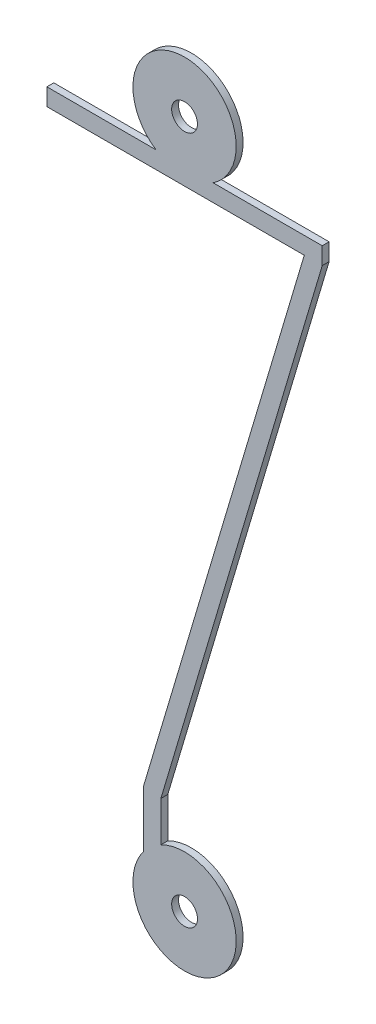
ISO-10303-21;
HEADER;
FILE_DESCRIPTION(('STEP AP214'),'2;1');
FILE_NAME('part.step','',(''),(''),'','','');
FILE_SCHEMA(('AUTOMOTIVE_DESIGN { 1 0 10303 214 1 1 1 1 }'));
ENDSEC;
DATA;
#1=APPLICATION_CONTEXT('core data for automotive mechanical design processes');
#2=APPLICATION_PROTOCOL_DEFINITION('international standard','automotive_design',2000,#1);
#3=PRODUCT_CONTEXT('',#1,'mechanical');
#4=PRODUCT('Part','Part','',(#3));
#5=PRODUCT_RELATED_PRODUCT_CATEGORY('part','',(#4));
#6=PRODUCT_DEFINITION_FORMATION('','',#4);
#7=PRODUCT_DEFINITION_CONTEXT('part definition',#1,'design');
#8=PRODUCT_DEFINITION('design','',#6,#7);
#9=PRODUCT_DEFINITION_SHAPE('','',#8);
#10=(LENGTH_UNIT() NAMED_UNIT(*) SI_UNIT(.MILLI.,.METRE.));
#11=(NAMED_UNIT(*) PLANE_ANGLE_UNIT() SI_UNIT($,.RADIAN.));
#12=(NAMED_UNIT(*) SI_UNIT($,.STERADIAN.) SOLID_ANGLE_UNIT());
#13=UNCERTAINTY_MEASURE_WITH_UNIT(LENGTH_MEASURE(1.E-05),#10,'distance_accuracy_value','');
#14=(GEOMETRIC_REPRESENTATION_CONTEXT(3) GLOBAL_UNCERTAINTY_ASSIGNED_CONTEXT((#13)) GLOBAL_UNIT_ASSIGNED_CONTEXT((#10,
#11,#12)) REPRESENTATION_CONTEXT('',''));
#15=CARTESIAN_POINT('',(0.,0.,0.));
#16=DIRECTION('',(0.,0.,1.));
#17=DIRECTION('',(1.,0.,0.));
#18=AXIS2_PLACEMENT_3D('',#15,#16,#17);
#19=CARTESIAN_POINT('',(0.,10.,0.1));
#20=DIRECTION('',(0.,0.,1.));
#21=DIRECTION('',(1.,0.,0.));
#22=AXIS2_PLACEMENT_3D('',#19,#20,#21);
#23=PLANE('',#22);
#24=CARTESIAN_POINT('',(0.,10.,0.1));
#25=DIRECTION('',(0.,0.,1.));
#26=DIRECTION('',(1.,0.,0.));
#27=AXIS2_PLACEMENT_3D('',#24,#25,#26);
#28=CIRCLE('',#27,0.375);
#29=CARTESIAN_POINT('',(0.375,10.,0.1));
#30=VERTEX_POINT('',#29);
#31=EDGE_CURVE('E155',#30,#30,#28,.T.);
#32=ORIENTED_EDGE('',*,*,#31,.F.);
#33=EDGE_LOOP('',(#32));
#34=FACE_BOUND('',#33,.T.);
#35=CARTESIAN_POINT('',(0.,10.,0.1));
#36=DIRECTION('',(0.,0.,1.));
#37=DIRECTION('',(1.,0.,0.));
#38=AXIS2_PLACEMENT_3D('',#35,#36,#37);
#39=CIRCLE('',#38,1.5);
#40=CARTESIAN_POINT('',(0.829156197588853,8.75,0.1));
#41=VERTEX_POINT('',#40);
#42=CARTESIAN_POINT('',(-0.829156197588853,8.75,0.1));
#43=VERTEX_POINT('',#42);
#44=EDGE_CURVE('E172',#41,#43,#39,.T.);
#45=ORIENTED_EDGE('',*,*,#44,.T.);
#46=DIRECTION('',(-1.,0.,0.));
#47=VECTOR('',#46,1.);
#48=CARTESIAN_POINT('',(-4.,8.75,0.1));
#49=LINE('',#48,#47);
#50=CARTESIAN_POINT('',(-4.,8.75,0.1));
#51=VERTEX_POINT('',#50);
#52=EDGE_CURVE('E105',#43,#51,#49,.T.);
#53=ORIENTED_EDGE('',*,*,#52,.T.);
#54=DIRECTION('',(0.,-1.,0.));
#55=VECTOR('',#54,1.);
#56=CARTESIAN_POINT('',(-4.,8.75,0.1));
#57=LINE('',#56,#55);
#58=CARTESIAN_POINT('',(-4.,8.25,0.1));
#59=VERTEX_POINT('',#58);
#60=EDGE_CURVE('E196',#51,#59,#57,.T.);
#61=ORIENTED_EDGE('',*,*,#60,.T.);
#62=DIRECTION('',(1.,0.,0.));
#63=VECTOR('',#62,1.);
#64=CARTESIAN_POINT('',(-4.,8.25,0.1));
#65=LINE('',#64,#63);
#66=CARTESIAN_POINT('',(3.47832550917606,8.25,0.1));
#67=VERTEX_POINT('',#66);
#68=EDGE_CURVE('E215',#59,#67,#65,.T.);
#69=ORIENTED_EDGE('',*,*,#68,.T.);
#70=DIRECTION('',(-0.285253594774189,-0.958452078441276,0.));
#71=VECTOR('',#70,1.);
#72=CARTESIAN_POINT('',(3.47832550917606,8.25,0.1));
#73=LINE('',#72,#71);
#74=CARTESIAN_POINT('',(-1.18749999999999,-7.42717371083153,0.1));
#75=VERTEX_POINT('',#74);
#76=EDGE_CURVE('E212',#67,#75,#73,.T.);
#77=ORIENTED_EDGE('',*,*,#76,.T.);
#78=DIRECTION('',(0.,-1.,0.));
#79=VECTOR('',#78,1.);
#80=CARTESIAN_POINT('',(-1.18749999999999,-9.08357010633655,0.1));
#81=LINE('',#80,#79);
#82=CARTESIAN_POINT('',(-1.18749999999999,-9.08357010633655,0.1));
#83=VERTEX_POINT('',#82);
#84=EDGE_CURVE('E214',#75,#83,#81,.T.);
#85=ORIENTED_EDGE('',*,*,#84,.T.);
#86=CARTESIAN_POINT('',(0.,-10.,0.1));
#87=DIRECTION('',(0.,0.,1.));
#88=DIRECTION('',(1.,0.,0.));
#89=AXIS2_PLACEMENT_3D('',#86,#87,#88);
#90=CIRCLE('',#89,1.5);
#91=CARTESIAN_POINT('',(-0.687499999999994,-8.66682943701865,0.1));
#92=VERTEX_POINT('',#91);
#93=EDGE_CURVE('E217',#83,#92,#90,.T.);
#94=ORIENTED_EDGE('',*,*,#93,.T.);
#95=DIRECTION('',(0.,1.,0.));
#96=VECTOR('',#95,1.);
#97=CARTESIAN_POINT('',(-0.687499999999994,-8.66682943701865,0.1));
#98=LINE('',#97,#96);
#99=CARTESIAN_POINT('',(-0.687499999999994,-7.5,0.1));
#100=VERTEX_POINT('',#99);
#101=EDGE_CURVE('E133',#92,#100,#98,.T.);
#102=ORIENTED_EDGE('',*,*,#101,.T.);
#103=DIRECTION('',(0.285253594774189,0.958452078441276,0.));
#104=VECTOR('',#103,1.);
#105=CARTESIAN_POINT('',(4.,8.25,0.1));
#106=LINE('',#105,#104);
#107=CARTESIAN_POINT('',(4.,8.25,0.1));
#108=VERTEX_POINT('',#107);
#109=EDGE_CURVE('E127',#100,#108,#106,.T.);
#110=ORIENTED_EDGE('',*,*,#109,.T.);
#111=DIRECTION('',(0.,1.,0.));
#112=VECTOR('',#111,1.);
#113=CARTESIAN_POINT('',(4.,8.75,0.1));
#114=LINE('',#113,#112);
#115=CARTESIAN_POINT('',(4.,8.75,0.1));
#116=VERTEX_POINT('',#115);
#117=EDGE_CURVE('E131',#108,#116,#114,.T.);
#118=ORIENTED_EDGE('',*,*,#117,.T.);
#119=DIRECTION('',(-1.,0.,0.));
#120=VECTOR('',#119,1.);
#121=CARTESIAN_POINT('',(0.829156197588853,8.75,0.1));
#122=LINE('',#121,#120);
#123=EDGE_CURVE('E53',#116,#41,#122,.T.);
#124=ORIENTED_EDGE('',*,*,#123,.T.);
#125=EDGE_LOOP('',(#45,#53,#61,#69,#77,#85,#94,#102,#110,#118,#124));
#126=FACE_BOUND('',#125,.T.);
#127=CARTESIAN_POINT('',(0.,-10.,0.1));
#128=DIRECTION('',(0.,0.,1.));
#129=DIRECTION('',(1.,0.,0.));
#130=AXIS2_PLACEMENT_3D('',#127,#128,#129);
#131=CIRCLE('',#130,0.375);
#132=CARTESIAN_POINT('',(0.375000000000006,-10.,0.1));
#133=VERTEX_POINT('',#132);
#134=EDGE_CURVE('E262',#133,#133,#131,.T.);
#135=ORIENTED_EDGE('',*,*,#134,.F.);
#136=EDGE_LOOP('',(#135));
#137=FACE_BOUND('',#136,.T.);
#138=ADVANCED_FACE('F36',(#34,#126,#137),#23,.T.);
#139=CARTESIAN_POINT('',(0.,10.,-0.1));
#140=DIRECTION('',(0.,0.,1.));
#141=DIRECTION('',(1.,0.,0.));
#142=AXIS2_PLACEMENT_3D('',#139,#140,#141);
#143=PLANE('',#142);
#144=CARTESIAN_POINT('',(0.,10.,-0.1));
#145=DIRECTION('',(0.,0.,1.));
#146=DIRECTION('',(1.,0.,0.));
#147=AXIS2_PLACEMENT_3D('',#144,#145,#146);
#148=CIRCLE('',#147,1.5);
#149=CARTESIAN_POINT('',(0.829156197588853,8.75,-0.1));
#150=VERTEX_POINT('',#149);
#151=CARTESIAN_POINT('',(-0.829156197588853,8.75,-0.1));
#152=VERTEX_POINT('',#151);
#153=EDGE_CURVE('E151',#150,#152,#148,.T.);
#154=ORIENTED_EDGE('',*,*,#153,.F.);
#155=DIRECTION('',(-1.,0.,0.));
#156=VECTOR('',#155,1.);
#157=CARTESIAN_POINT('',(0.829156197588853,8.75,-0.1));
#158=LINE('',#157,#156);
#159=CARTESIAN_POINT('',(4.,8.75,-0.1));
#160=VERTEX_POINT('',#159);
#161=EDGE_CURVE('E97',#160,#150,#158,.T.);
#162=ORIENTED_EDGE('',*,*,#161,.F.);
#163=DIRECTION('',(0.,1.,0.));
#164=VECTOR('',#163,1.);
#165=CARTESIAN_POINT('',(4.,8.75,-0.1));
#166=LINE('',#165,#164);
#167=CARTESIAN_POINT('',(4.,8.25,-0.1));
#168=VERTEX_POINT('',#167);
#169=EDGE_CURVE('E91',#168,#160,#166,.T.);
#170=ORIENTED_EDGE('',*,*,#169,.F.);
#171=DIRECTION('',(0.285253594774189,0.958452078441276,0.));
#172=VECTOR('',#171,1.);
#173=CARTESIAN_POINT('',(4.,8.25,-0.1));
#174=LINE('',#173,#172);
#175=CARTESIAN_POINT('',(-0.687499999999994,-7.5,-0.1));
#176=VERTEX_POINT('',#175);
#177=EDGE_CURVE('E141',#176,#168,#174,.T.);
#178=ORIENTED_EDGE('',*,*,#177,.F.);
#179=DIRECTION('',(0.,1.,0.));
#180=VECTOR('',#179,1.);
#181=CARTESIAN_POINT('',(-0.687499999999994,-8.66682943701865,-0.1));
#182=LINE('',#181,#180);
#183=CARTESIAN_POINT('',(-0.687499999999994,-8.66682943701865,-0.1));
#184=VERTEX_POINT('',#183);
#185=EDGE_CURVE('E167',#184,#176,#182,.T.);
#186=ORIENTED_EDGE('',*,*,#185,.F.);
#187=CARTESIAN_POINT('',(0.,-10.,-0.1));
#188=DIRECTION('',(0.,0.,1.));
#189=DIRECTION('',(1.,0.,0.));
#190=AXIS2_PLACEMENT_3D('',#187,#188,#189);
#191=CIRCLE('',#190,1.5);
#192=CARTESIAN_POINT('',(-1.18749999999999,-9.08357010633655,-0.1));
#193=VERTEX_POINT('',#192);
#194=EDGE_CURVE('E165',#193,#184,#191,.T.);
#195=ORIENTED_EDGE('',*,*,#194,.F.);
#196=DIRECTION('',(0.,-1.,0.));
#197=VECTOR('',#196,1.);
#198=CARTESIAN_POINT('',(-1.18749999999999,-9.08357010633655,-0.1));
#199=LINE('',#198,#197);
#200=CARTESIAN_POINT('',(-1.18749999999999,-7.42717371083153,-0.1));
#201=VERTEX_POINT('',#200);
#202=EDGE_CURVE('E163',#201,#193,#199,.T.);
#203=ORIENTED_EDGE('',*,*,#202,.F.);
#204=DIRECTION('',(-0.285253594774189,-0.958452078441276,0.));
#205=VECTOR('',#204,1.);
#206=CARTESIAN_POINT('',(3.47832550917606,8.25,-0.1));
#207=LINE('',#206,#205);
#208=CARTESIAN_POINT('',(3.47832550917606,8.25,-0.1));
#209=VERTEX_POINT('',#208);
#210=EDGE_CURVE('E161',#209,#201,#207,.T.);
#211=ORIENTED_EDGE('',*,*,#210,.F.);
#212=DIRECTION('',(1.,0.,0.));
#213=VECTOR('',#212,1.);
#214=CARTESIAN_POINT('',(-4.,8.25,-0.1));
#215=LINE('',#214,#213);
#216=CARTESIAN_POINT('',(-4.,8.25,-0.1));
#217=VERTEX_POINT('',#216);
#218=EDGE_CURVE('E159',#217,#209,#215,.T.);
#219=ORIENTED_EDGE('',*,*,#218,.F.);
#220=DIRECTION('',(0.,-1.,0.));
#221=VECTOR('',#220,1.);
#222=CARTESIAN_POINT('',(-4.,8.75,-0.1));
#223=LINE('',#222,#221);
#224=CARTESIAN_POINT('',(-4.,8.75,-0.1));
#225=VERTEX_POINT('',#224);
#226=EDGE_CURVE('E157',#225,#217,#223,.T.);
#227=ORIENTED_EDGE('',*,*,#226,.F.);
#228=DIRECTION('',(-1.,0.,0.));
#229=VECTOR('',#228,1.);
#230=CARTESIAN_POINT('',(-4.,8.75,-0.1));
#231=LINE('',#230,#229);
#232=EDGE_CURVE('E154',#152,#225,#231,.T.);
#233=ORIENTED_EDGE('',*,*,#232,.F.);
#234=EDGE_LOOP('',(#154,#162,#170,#178,#186,#195,#203,#211,#219,#227,#233));
#235=FACE_BOUND('',#234,.T.);
#236=CARTESIAN_POINT('',(0.,10.,-0.1));
#237=DIRECTION('',(0.,0.,1.));
#238=DIRECTION('',(1.,0.,0.));
#239=AXIS2_PLACEMENT_3D('',#236,#237,#238);
#240=CIRCLE('',#239,0.375);
#241=CARTESIAN_POINT('',(0.375,10.,-0.1));
#242=VERTEX_POINT('',#241);
#243=EDGE_CURVE('E268',#242,#242,#240,.T.);
#244=ORIENTED_EDGE('',*,*,#243,.T.);
#245=EDGE_LOOP('',(#244));
#246=FACE_BOUND('',#245,.T.);
#247=CARTESIAN_POINT('',(0.,-10.,-0.1));
#248=DIRECTION('',(0.,0.,1.));
#249=DIRECTION('',(1.,0.,0.));
#250=AXIS2_PLACEMENT_3D('',#247,#248,#249);
#251=CIRCLE('',#250,0.375);
#252=CARTESIAN_POINT('',(0.375000000000006,-10.,-0.1));
#253=VERTEX_POINT('',#252);
#254=EDGE_CURVE('E265',#253,#253,#251,.T.);
#255=ORIENTED_EDGE('',*,*,#254,.T.);
#256=EDGE_LOOP('',(#255));
#257=FACE_BOUND('',#256,.T.);
#258=ADVANCED_FACE('F200',(#235,#246,#257),#143,.F.);
#259=CARTESIAN_POINT('',(0.,10.,0.1));
#260=DIRECTION('',(0.,0.,-1.));
#261=DIRECTION('',(-1.,0.,0.));
#262=AXIS2_PLACEMENT_3D('',#259,#260,#261);
#263=CYLINDRICAL_SURFACE('',#262,1.5);
#264=ORIENTED_EDGE('',*,*,#153,.T.);
#265=DIRECTION('',(0.,0.,-1.));
#266=VECTOR('',#265,1.);
#267=CARTESIAN_POINT('',(-0.829156197588853,8.75,0.1));
#268=LINE('',#267,#266);
#269=EDGE_CURVE('E11',#43,#152,#268,.T.);
#270=ORIENTED_EDGE('',*,*,#269,.F.);
#271=ORIENTED_EDGE('',*,*,#44,.F.);
#272=DIRECTION('',(0.,0.,-1.));
#273=VECTOR('',#272,1.);
#274=CARTESIAN_POINT('',(0.829156197588853,8.75,0.1));
#275=LINE('',#274,#273);
#276=EDGE_CURVE('E147',#41,#150,#275,.T.);
#277=ORIENTED_EDGE('',*,*,#276,.T.);
#278=EDGE_LOOP('',(#264,#270,#271,#277));
#279=FACE_BOUND('',#278,.T.);
#280=ADVANCED_FACE('F38',(#279),#263,.T.);
#281=CARTESIAN_POINT('',(-4.,8.75,0.1));
#282=DIRECTION('',(0.,-1.,0.));
#283=DIRECTION('',(0.,0.,-1.));
#284=AXIS2_PLACEMENT_3D('',#281,#282,#283);
#285=PLANE('',#284);
#286=ORIENTED_EDGE('',*,*,#232,.T.);
#287=DIRECTION('',(0.,0.,-1.));
#288=VECTOR('',#287,1.);
#289=CARTESIAN_POINT('',(-4.,8.75,0.1));
#290=LINE('',#289,#288);
#291=EDGE_CURVE('E45',#51,#225,#290,.T.);
#292=ORIENTED_EDGE('',*,*,#291,.F.);
#293=ORIENTED_EDGE('',*,*,#52,.F.);
#294=ORIENTED_EDGE('',*,*,#269,.T.);
#295=EDGE_LOOP('',(#286,#292,#293,#294));
#296=FACE_BOUND('',#295,.T.);
#297=ADVANCED_FACE('F351',(#296),#285,.F.);
#298=CARTESIAN_POINT('',(-4.,8.75,0.1));
#299=DIRECTION('',(1.,0.,0.));
#300=DIRECTION('',(0.,0.,-1.));
#301=AXIS2_PLACEMENT_3D('',#298,#299,#300);
#302=PLANE('',#301);
#303=ORIENTED_EDGE('',*,*,#226,.T.);
#304=DIRECTION('',(0.,0.,-1.));
#305=VECTOR('',#304,1.);
#306=CARTESIAN_POINT('',(-4.,8.25,0.1));
#307=LINE('',#306,#305);
#308=EDGE_CURVE('E188',#59,#217,#307,.T.);
#309=ORIENTED_EDGE('',*,*,#308,.F.);
#310=ORIENTED_EDGE('',*,*,#60,.F.);
#311=ORIENTED_EDGE('',*,*,#291,.T.);
#312=EDGE_LOOP('',(#303,#309,#310,#311));
#313=FACE_BOUND('',#312,.T.);
#314=ADVANCED_FACE('F194',(#313),#302,.F.);
#315=CARTESIAN_POINT('',(-4.,8.25,0.1));
#316=DIRECTION('',(0.,1.,0.));
#317=DIRECTION('',(0.,0.,1.));
#318=AXIS2_PLACEMENT_3D('',#315,#316,#317);
#319=PLANE('',#318);
#320=ORIENTED_EDGE('',*,*,#218,.T.);
#321=DIRECTION('',(0.,0.,-1.));
#322=VECTOR('',#321,1.);
#323=CARTESIAN_POINT('',(3.47832550917606,8.25,0.1));
#324=LINE('',#323,#322);
#325=EDGE_CURVE('E185',#67,#209,#324,.T.);
#326=ORIENTED_EDGE('',*,*,#325,.F.);
#327=ORIENTED_EDGE('',*,*,#68,.F.);
#328=ORIENTED_EDGE('',*,*,#308,.T.);
#329=EDGE_LOOP('',(#320,#326,#327,#328));
#330=FACE_BOUND('',#329,.T.);
#331=ADVANCED_FACE('F206',(#330),#319,.F.);
#332=CARTESIAN_POINT('',(3.47832550917606,8.25,0.1));
#333=DIRECTION('',(0.958452078441276,-0.285253594774189,0.));
#334=DIRECTION('',(0.285253594774189,0.958452078441277,0.));
#335=AXIS2_PLACEMENT_3D('',#332,#333,#334);
#336=PLANE('',#335);
#337=ORIENTED_EDGE('',*,*,#210,.T.);
#338=DIRECTION('',(0.,0.,-1.));
#339=VECTOR('',#338,1.);
#340=CARTESIAN_POINT('',(-1.18749999999999,-7.42717371083153,0.1));
#341=LINE('',#340,#339);
#342=EDGE_CURVE('E182',#75,#201,#341,.T.);
#343=ORIENTED_EDGE('',*,*,#342,.F.);
#344=ORIENTED_EDGE('',*,*,#76,.F.);
#345=ORIENTED_EDGE('',*,*,#325,.T.);
#346=EDGE_LOOP('',(#337,#343,#344,#345));
#347=FACE_BOUND('',#346,.T.);
#348=ADVANCED_FACE('F210',(#347),#336,.F.);
#349=CARTESIAN_POINT('',(-1.18749999999999,-9.08357010633655,0.1));
#350=DIRECTION('',(1.,0.,0.));
#351=DIRECTION('',(0.,1.,0.));
#352=AXIS2_PLACEMENT_3D('',#349,#350,#351);
#353=PLANE('',#352);
#354=ORIENTED_EDGE('',*,*,#202,.T.);
#355=DIRECTION('',(0.,0.,-1.));
#356=VECTOR('',#355,1.);
#357=CARTESIAN_POINT('',(-1.18749999999999,-9.08357010633655,0.1));
#358=LINE('',#357,#356);
#359=EDGE_CURVE('E179',#83,#193,#358,.T.);
#360=ORIENTED_EDGE('',*,*,#359,.F.);
#361=ORIENTED_EDGE('',*,*,#84,.F.);
#362=ORIENTED_EDGE('',*,*,#342,.T.);
#363=EDGE_LOOP('',(#354,#360,#361,#362));
#364=FACE_BOUND('',#363,.T.);
#365=ADVANCED_FACE('F317',(#364),#353,.F.);
#366=CARTESIAN_POINT('',(0.,-10.,0.1));
#367=DIRECTION('',(0.,0.,-1.));
#368=DIRECTION('',(-1.,0.,0.));
#369=AXIS2_PLACEMENT_3D('',#366,#367,#368);
#370=CYLINDRICAL_SURFACE('',#369,1.5);
#371=ORIENTED_EDGE('',*,*,#194,.T.);
#372=DIRECTION('',(0.,0.,-1.));
#373=VECTOR('',#372,1.);
#374=CARTESIAN_POINT('',(-0.687499999999994,-8.66682943701865,0.1));
#375=LINE('',#374,#373);
#376=EDGE_CURVE('E176',#92,#184,#375,.T.);
#377=ORIENTED_EDGE('',*,*,#376,.F.);
#378=ORIENTED_EDGE('',*,*,#93,.F.);
#379=ORIENTED_EDGE('',*,*,#359,.T.);
#380=EDGE_LOOP('',(#371,#377,#378,#379));
#381=FACE_BOUND('',#380,.T.);
#382=ADVANCED_FACE('F226',(#381),#370,.T.);
#383=CARTESIAN_POINT('',(-0.687499999999994,-8.66682943701865,0.1));
#384=DIRECTION('',(-1.,0.,0.));
#385=DIRECTION('',(0.,0.,1.));
#386=AXIS2_PLACEMENT_3D('',#383,#384,#385);
#387=PLANE('',#386);
#388=ORIENTED_EDGE('',*,*,#185,.T.);
#389=DIRECTION('',(0.,0.,-1.));
#390=VECTOR('',#389,1.);
#391=CARTESIAN_POINT('',(-0.687499999999994,-7.5,0.1));
#392=LINE('',#391,#390);
#393=EDGE_CURVE('E142',#100,#176,#392,.T.);
#394=ORIENTED_EDGE('',*,*,#393,.F.);
#395=ORIENTED_EDGE('',*,*,#101,.F.);
#396=ORIENTED_EDGE('',*,*,#376,.T.);
#397=EDGE_LOOP('',(#388,#394,#395,#396));
#398=FACE_BOUND('',#397,.T.);
#399=ADVANCED_FACE('F230',(#398),#387,.F.);
#400=CARTESIAN_POINT('',(4.,8.25,0.1));
#401=DIRECTION('',(-0.958452078441277,0.285253594774189,0.));
#402=DIRECTION('',(-0.285253594774189,-0.958452078441277,0.));
#403=AXIS2_PLACEMENT_3D('',#400,#401,#402);
#404=PLANE('',#403);
#405=ORIENTED_EDGE('',*,*,#177,.T.);
#406=DIRECTION('',(0.,0.,-1.));
#407=VECTOR('',#406,1.);
#408=CARTESIAN_POINT('',(4.,8.25,0.1));
#409=LINE('',#408,#407);
#410=EDGE_CURVE('E138',#108,#168,#409,.T.);
#411=ORIENTED_EDGE('',*,*,#410,.F.);
#412=ORIENTED_EDGE('',*,*,#109,.F.);
#413=ORIENTED_EDGE('',*,*,#393,.T.);
#414=EDGE_LOOP('',(#405,#411,#412,#413));
#415=FACE_BOUND('',#414,.T.);
#416=ADVANCED_FACE('F139',(#415),#404,.F.);
#417=CARTESIAN_POINT('',(4.,8.75,0.1));
#418=DIRECTION('',(-1.,0.,0.));
#419=DIRECTION('',(0.,0.,1.));
#420=AXIS2_PLACEMENT_3D('',#417,#418,#419);
#421=PLANE('',#420);
#422=ORIENTED_EDGE('',*,*,#169,.T.);
#423=DIRECTION('',(0.,0.,-1.));
#424=VECTOR('',#423,1.);
#425=CARTESIAN_POINT('',(4.,8.75,0.1));
#426=LINE('',#425,#424);
#427=EDGE_CURVE('E143',#116,#160,#426,.T.);
#428=ORIENTED_EDGE('',*,*,#427,.F.);
#429=ORIENTED_EDGE('',*,*,#117,.F.);
#430=ORIENTED_EDGE('',*,*,#410,.T.);
#431=EDGE_LOOP('',(#422,#428,#429,#430));
#432=FACE_BOUND('',#431,.T.);
#433=ADVANCED_FACE('F145',(#432),#421,.F.);
#434=CARTESIAN_POINT('',(0.829156197588853,8.75,0.1));
#435=DIRECTION('',(0.,-1.,0.));
#436=DIRECTION('',(1.,0.,0.));
#437=AXIS2_PLACEMENT_3D('',#434,#435,#436);
#438=PLANE('',#437);
#439=ORIENTED_EDGE('',*,*,#161,.T.);
#440=ORIENTED_EDGE('',*,*,#276,.F.);
#441=ORIENTED_EDGE('',*,*,#123,.F.);
#442=ORIENTED_EDGE('',*,*,#427,.T.);
#443=EDGE_LOOP('',(#439,#440,#441,#442));
#444=FACE_BOUND('',#443,.T.);
#445=ADVANCED_FACE('F234',(#444),#438,.F.);
#446=CARTESIAN_POINT('',(0.,10.,0.1));
#447=DIRECTION('',(0.,0.,-1.));
#448=DIRECTION('',(-1.,0.,0.));
#449=AXIS2_PLACEMENT_3D('',#446,#447,#448);
#450=CYLINDRICAL_SURFACE('',#449,0.375);
#451=ORIENTED_EDGE('',*,*,#31,.T.);
#452=EDGE_LOOP('',(#451));
#453=FACE_BOUND('',#452,.T.);
#454=ORIENTED_EDGE('',*,*,#243,.F.);
#455=EDGE_LOOP('',(#454));
#456=FACE_BOUND('',#455,.T.);
#457=ADVANCED_FACE('F236',(#453,#456),#450,.F.);
#458=CARTESIAN_POINT('',(0.,-10.,0.1));
#459=DIRECTION('',(0.,0.,-1.));
#460=DIRECTION('',(-1.,0.,0.));
#461=AXIS2_PLACEMENT_3D('',#458,#459,#460);
#462=CYLINDRICAL_SURFACE('',#461,0.375);
#463=ORIENTED_EDGE('',*,*,#134,.T.);
#464=EDGE_LOOP('',(#463));
#465=FACE_BOUND('',#464,.T.);
#466=ORIENTED_EDGE('',*,*,#254,.F.);
#467=EDGE_LOOP('',(#466));
#468=FACE_BOUND('',#467,.T.);
#469=ADVANCED_FACE('F242',(#465,#468),#462,.F.);
#470=CLOSED_SHELL('',(#138,#258,#280,#297,#314,#331,#348,#365,#382,#399,#416,#433,#445,#457,#469));
#471=MANIFOLD_SOLID_BREP('B2',#470);
#472=ADVANCED_BREP_SHAPE_REPRESENTATION('',(#18,#471),#14);
#473=SHAPE_DEFINITION_REPRESENTATION(#9,#472);
ENDSEC;
END-ISO-10303-21;
